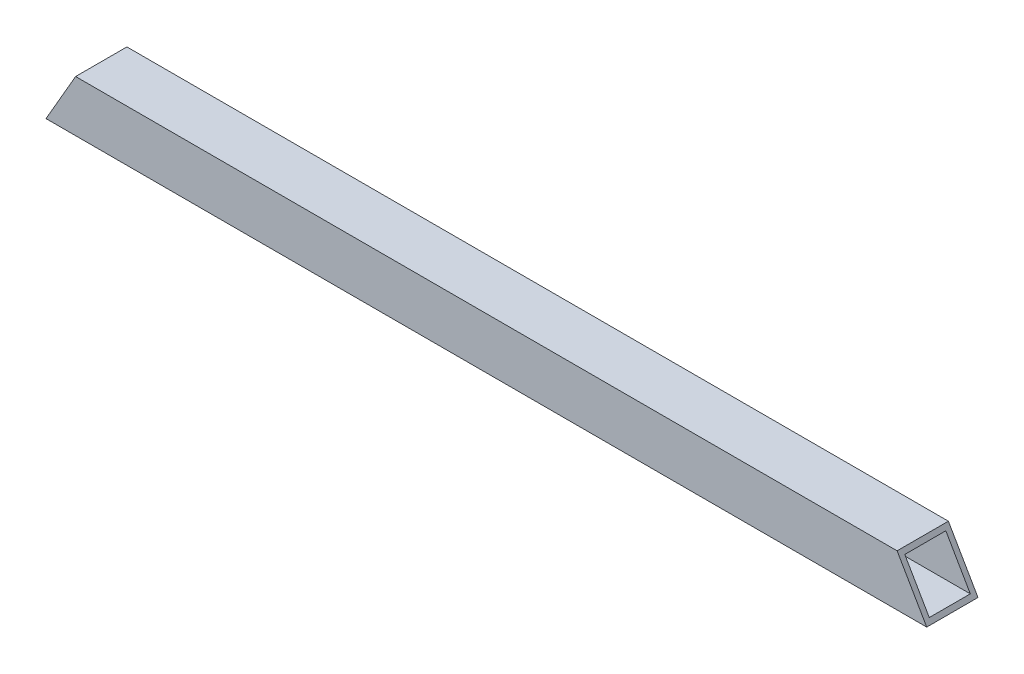
ISO-10303-21;
HEADER;
FILE_DESCRIPTION(('STEP AP214'),'2;1');
FILE_NAME('part.step','',(''),(''),'','','');
FILE_SCHEMA(('AUTOMOTIVE_DESIGN { 1 0 10303 214 1 1 1 1 }'));
ENDSEC;
DATA;
#1=APPLICATION_CONTEXT('core data for automotive mechanical design processes');
#2=APPLICATION_PROTOCOL_DEFINITION('international standard','automotive_design',2000,#1);
#3=PRODUCT_CONTEXT('',#1,'mechanical');
#4=PRODUCT('Part','Part','',(#3));
#5=PRODUCT_RELATED_PRODUCT_CATEGORY('part','',(#4));
#6=PRODUCT_DEFINITION_FORMATION('','',#4);
#7=PRODUCT_DEFINITION_CONTEXT('part definition',#1,'design');
#8=PRODUCT_DEFINITION('design','',#6,#7);
#9=PRODUCT_DEFINITION_SHAPE('','',#8);
#10=(LENGTH_UNIT() NAMED_UNIT(*) SI_UNIT(.MILLI.,.METRE.));
#11=(NAMED_UNIT(*) PLANE_ANGLE_UNIT() SI_UNIT($,.RADIAN.));
#12=(NAMED_UNIT(*) SI_UNIT($,.STERADIAN.) SOLID_ANGLE_UNIT());
#13=UNCERTAINTY_MEASURE_WITH_UNIT(LENGTH_MEASURE(1.E-05),#10,'distance_accuracy_value','');
#14=(GEOMETRIC_REPRESENTATION_CONTEXT(3) GLOBAL_UNCERTAINTY_ASSIGNED_CONTEXT((#13)) GLOBAL_UNIT_ASSIGNED_CONTEXT((#10,
#11,#12)) REPRESENTATION_CONTEXT('',''));
#15=CARTESIAN_POINT('',(0.,0.,0.));
#16=DIRECTION('',(0.,0.,1.));
#17=DIRECTION('',(1.,0.,0.));
#18=AXIS2_PLACEMENT_3D('',#15,#16,#17);
#19=CARTESIAN_POINT('',(-48.421052631579,24.6052631578947,20.));
#20=DIRECTION('',(0.865969252911153,-0.50009724355619,0.));
#21=DIRECTION('',(0.50009724355619,0.865969252911153,0.));
#22=AXIS2_PLACEMENT_3D('',#19,#20,#21);
#23=PLANE('',#22);
#24=DIRECTION('',(0.,0.,1.));
#25=VECTOR('',#24,1.);
#26=CARTESIAN_POINT('',(-49.4212471186913,22.8733246520724,20.));
#27=LINE('',#26,#25);
#28=CARTESIAN_POINT('',(-49.4212471186913,22.8733246520724,2.));
#29=VERTEX_POINT('',#28);
#30=CARTESIAN_POINT('',(-49.4212471186913,22.8733246520724,18.));
#31=VERTEX_POINT('',#30);
#32=EDGE_CURVE('E147',#29,#31,#27,.T.);
#33=ORIENTED_EDGE('',*,*,#32,.T.);
#34=DIRECTION('',(-0.50009724355619,-0.865969252911153,0.));
#35=VECTOR('',#34,1.);
#36=CARTESIAN_POINT('',(-48.421052631579,24.6052631578947,18.));
#37=LINE('',#36,#35);
#38=CARTESIAN_POINT('',(-58.9708581444666,6.33720166371705,18.));
#39=VERTEX_POINT('',#38);
#40=EDGE_CURVE('E137',#31,#39,#37,.T.);
#41=ORIENTED_EDGE('',*,*,#40,.T.);
#42=DIRECTION('',(0.,0.,-1.));
#43=VECTOR('',#42,1.);
#44=CARTESIAN_POINT('',(-58.9708581444666,6.33720166371705,20.));
#45=LINE('',#44,#43);
#46=CARTESIAN_POINT('',(-58.9708581444666,6.33720166371705,1.99999999999999));
#47=VERTEX_POINT('',#46);
#48=EDGE_CURVE('E151',#39,#47,#45,.T.);
#49=ORIENTED_EDGE('',*,*,#48,.T.);
#50=DIRECTION('',(0.50009724355619,0.865969252911153,0.));
#51=VECTOR('',#50,1.);
#52=CARTESIAN_POINT('',(-48.421052631579,24.6052631578947,2.));
#53=LINE('',#52,#51);
#54=EDGE_CURVE('E106',#47,#29,#53,.T.);
#55=ORIENTED_EDGE('',*,*,#54,.T.);
#56=EDGE_LOOP('',(#33,#41,#49,#55));
#57=FACE_BOUND('',#56,.T.);
#58=DIRECTION('',(-0.50009724355619,-0.865969252911153,0.));
#59=VECTOR('',#58,1.);
#60=CARTESIAN_POINT('',(-48.421052631579,24.6052631578947,0.));
#61=LINE('',#60,#59);
#62=CARTESIAN_POINT('',(-48.421052631579,24.6052631578947,0.));
#63=VERTEX_POINT('',#62);
#64=CARTESIAN_POINT('',(-59.9710526315789,4.60526315789474,0.));
#65=VERTEX_POINT('',#64);
#66=EDGE_CURVE('E134',#63,#65,#61,.T.);
#67=ORIENTED_EDGE('',*,*,#66,.T.);
#68=DIRECTION('',(0.,0.,-1.));
#69=VECTOR('',#68,1.);
#70=CARTESIAN_POINT('',(-59.9710526315789,4.60526315789474,20.));
#71=LINE('',#70,#69);
#72=CARTESIAN_POINT('',(-59.9710526315789,4.60526315789474,20.));
#73=VERTEX_POINT('',#72);
#74=EDGE_CURVE('E99',#73,#65,#71,.T.);
#75=ORIENTED_EDGE('',*,*,#74,.F.);
#76=DIRECTION('',(-0.50009724355619,-0.865969252911153,0.));
#77=VECTOR('',#76,1.);
#78=CARTESIAN_POINT('',(-48.421052631579,24.6052631578947,20.));
#79=LINE('',#78,#77);
#80=CARTESIAN_POINT('',(-48.421052631579,24.6052631578947,20.));
#81=VERTEX_POINT('',#80);
#82=EDGE_CURVE('E129',#81,#73,#79,.T.);
#83=ORIENTED_EDGE('',*,*,#82,.F.);
#84=DIRECTION('',(0.,0.,-1.));
#85=VECTOR('',#84,1.);
#86=CARTESIAN_POINT('',(-48.421052631579,24.6052631578947,20.));
#87=LINE('',#86,#85);
#88=EDGE_CURVE('E123',#81,#63,#87,.T.);
#89=ORIENTED_EDGE('',*,*,#88,.T.);
#90=EDGE_LOOP('',(#67,#75,#83,#89));
#91=FACE_BOUND('',#90,.T.);
#92=ADVANCED_FACE('F33',(#57,#91),#23,.F.);
#93=CARTESIAN_POINT('',(-59.9710526315789,4.60526315789474,20.));
#94=DIRECTION('',(0.,1.,0.));
#95=DIRECTION('',(0.,0.,1.));
#96=AXIS2_PLACEMENT_3D('',#93,#94,#95);
#97=PLANE('',#96);
#98=DIRECTION('',(1.,0.,0.));
#99=VECTOR('',#98,1.);
#100=CARTESIAN_POINT('',(-59.9710526315789,4.60526315789474,0.));
#101=LINE('',#100,#99);
#102=CARTESIAN_POINT('',(283.538947368421,4.60526315789474,0.));
#103=VERTEX_POINT('',#102);
#104=EDGE_CURVE('E132',#65,#103,#101,.T.);
#105=ORIENTED_EDGE('',*,*,#104,.T.);
#106=DIRECTION('',(0.,0.,-1.));
#107=VECTOR('',#106,1.);
#108=CARTESIAN_POINT('',(283.538947368421,4.60526315789474,20.));
#109=LINE('',#108,#107);
#110=CARTESIAN_POINT('',(283.538947368421,4.60526315789474,20.));
#111=VERTEX_POINT('',#110);
#112=EDGE_CURVE('E117',#111,#103,#109,.T.);
#113=ORIENTED_EDGE('',*,*,#112,.F.);
#114=DIRECTION('',(1.,0.,0.));
#115=VECTOR('',#114,1.);
#116=CARTESIAN_POINT('',(-59.9710526315789,4.60526315789474,20.));
#117=LINE('',#116,#115);
#118=EDGE_CURVE('E141',#73,#111,#117,.T.);
#119=ORIENTED_EDGE('',*,*,#118,.F.);
#120=ORIENTED_EDGE('',*,*,#74,.T.);
#121=EDGE_LOOP('',(#105,#113,#119,#120));
#122=FACE_BOUND('',#121,.T.);
#123=ADVANCED_FACE('F165',(#122),#97,.F.);
#124=CARTESIAN_POINT('',(271.988947368421,24.6052631578947,20.));
#125=DIRECTION('',(-0.865969252911153,-0.500097243556191,0.));
#126=DIRECTION('',(0.500097243556191,-0.865969252911153,0.));
#127=AXIS2_PLACEMENT_3D('',#124,#125,#126);
#128=PLANE('',#127);
#129=DIRECTION('',(0.,0.,1.));
#130=VECTOR('',#129,1.);
#131=CARTESIAN_POINT('',(282.538752881309,6.33720166371705,20.));
#132=LINE('',#131,#130);
#133=CARTESIAN_POINT('',(282.538752881309,6.33720166371705,1.99999999999999));
#134=VERTEX_POINT('',#133);
#135=CARTESIAN_POINT('',(282.538752881309,6.33720166371705,18.));
#136=VERTEX_POINT('',#135);
#137=EDGE_CURVE('E94',#134,#136,#132,.T.);
#138=ORIENTED_EDGE('',*,*,#137,.T.);
#139=DIRECTION('',(-0.500097243556191,0.865969252911153,0.));
#140=VECTOR('',#139,1.);
#141=CARTESIAN_POINT('',(271.988947368421,24.6052631578947,18.));
#142=LINE('',#141,#140);
#143=CARTESIAN_POINT('',(272.989141855533,22.8733246520724,18.));
#144=VERTEX_POINT('',#143);
#145=EDGE_CURVE('E11',#136,#144,#142,.T.);
#146=ORIENTED_EDGE('',*,*,#145,.T.);
#147=DIRECTION('',(0.,0.,-1.));
#148=VECTOR('',#147,1.);
#149=CARTESIAN_POINT('',(272.989141855533,22.8733246520724,20.));
#150=LINE('',#149,#148);
#151=CARTESIAN_POINT('',(272.989141855533,22.8733246520724,2.));
#152=VERTEX_POINT('',#151);
#153=EDGE_CURVE('E40',#144,#152,#150,.T.);
#154=ORIENTED_EDGE('',*,*,#153,.T.);
#155=DIRECTION('',(0.500097243556191,-0.865969252911153,0.));
#156=VECTOR('',#155,1.);
#157=CARTESIAN_POINT('',(271.988947368421,24.6052631578947,2.));
#158=LINE('',#157,#156);
#159=EDGE_CURVE('E98',#152,#134,#158,.T.);
#160=ORIENTED_EDGE('',*,*,#159,.T.);
#161=EDGE_LOOP('',(#138,#146,#154,#160));
#162=FACE_BOUND('',#161,.T.);
#163=DIRECTION('',(-0.500097243556191,0.865969252911153,0.));
#164=VECTOR('',#163,1.);
#165=CARTESIAN_POINT('',(271.988947368421,24.6052631578947,0.));
#166=LINE('',#165,#164);
#167=CARTESIAN_POINT('',(271.988947368421,24.6052631578947,0.));
#168=VERTEX_POINT('',#167);
#169=EDGE_CURVE('E130',#103,#168,#166,.T.);
#170=ORIENTED_EDGE('',*,*,#169,.T.);
#171=DIRECTION('',(0.,0.,-1.));
#172=VECTOR('',#171,1.);
#173=CARTESIAN_POINT('',(271.988947368421,24.6052631578947,20.));
#174=LINE('',#173,#172);
#175=CARTESIAN_POINT('',(271.988947368421,24.6052631578947,20.));
#176=VERTEX_POINT('',#175);
#177=EDGE_CURVE('E120',#176,#168,#174,.T.);
#178=ORIENTED_EDGE('',*,*,#177,.F.);
#179=DIRECTION('',(-0.500097243556191,0.865969252911153,0.));
#180=VECTOR('',#179,1.);
#181=CARTESIAN_POINT('',(271.988947368421,24.6052631578947,20.));
#182=LINE('',#181,#180);
#183=EDGE_CURVE('E139',#111,#176,#182,.T.);
#184=ORIENTED_EDGE('',*,*,#183,.F.);
#185=ORIENTED_EDGE('',*,*,#112,.T.);
#186=EDGE_LOOP('',(#170,#178,#184,#185));
#187=FACE_BOUND('',#186,.T.);
#188=ADVANCED_FACE('F111',(#162,#187),#128,.F.);
#189=CARTESIAN_POINT('',(-48.421052631579,24.6052631578947,20.));
#190=DIRECTION('',(0.,-1.,0.));
#191=DIRECTION('',(0.,0.,-1.));
#192=AXIS2_PLACEMENT_3D('',#189,#190,#191);
#193=PLANE('',#192);
#194=DIRECTION('',(-1.,0.,0.));
#195=VECTOR('',#194,1.);
#196=CARTESIAN_POINT('',(-48.421052631579,24.6052631578947,0.));
#197=LINE('',#196,#195);
#198=EDGE_CURVE('E127',#168,#63,#197,.T.);
#199=ORIENTED_EDGE('',*,*,#198,.T.);
#200=ORIENTED_EDGE('',*,*,#88,.F.);
#201=DIRECTION('',(-1.,0.,0.));
#202=VECTOR('',#201,1.);
#203=CARTESIAN_POINT('',(-48.421052631579,24.6052631578947,20.));
#204=LINE('',#203,#202);
#205=EDGE_CURVE('E126',#176,#81,#204,.T.);
#206=ORIENTED_EDGE('',*,*,#205,.F.);
#207=ORIENTED_EDGE('',*,*,#177,.T.);
#208=EDGE_LOOP('',(#199,#200,#206,#207));
#209=FACE_BOUND('',#208,.T.);
#210=ADVANCED_FACE('F182',(#209),#193,.F.);
#211=CARTESIAN_POINT('',(0.,0.,20.));
#212=DIRECTION('',(0.,0.,1.));
#213=DIRECTION('',(1.,0.,0.));
#214=AXIS2_PLACEMENT_3D('',#211,#212,#213);
#215=PLANE('',#214);
#216=ORIENTED_EDGE('',*,*,#82,.T.);
#217=ORIENTED_EDGE('',*,*,#118,.T.);
#218=ORIENTED_EDGE('',*,*,#183,.T.);
#219=ORIENTED_EDGE('',*,*,#205,.T.);
#220=EDGE_LOOP('',(#216,#217,#218,#219));
#221=FACE_BOUND('',#220,.T.);
#222=ADVANCED_FACE('F178',(#221),#215,.T.);
#223=CARTESIAN_POINT('',(0.,0.,0.));
#224=DIRECTION('',(0.,0.,1.));
#225=DIRECTION('',(1.,0.,0.));
#226=AXIS2_PLACEMENT_3D('',#223,#224,#225);
#227=PLANE('',#226);
#228=ORIENTED_EDGE('',*,*,#66,.F.);
#229=ORIENTED_EDGE('',*,*,#198,.F.);
#230=ORIENTED_EDGE('',*,*,#169,.F.);
#231=ORIENTED_EDGE('',*,*,#104,.F.);
#232=EDGE_LOOP('',(#228,#229,#230,#231));
#233=FACE_BOUND('',#232,.T.);
#234=ADVANCED_FACE('F172',(#233),#227,.F.);
#235=CARTESIAN_POINT('',(-59.9710526315789,22.8733246520724,18.));
#236=DIRECTION('',(0.,0.,1.));
#237=DIRECTION('',(0.,-1.,0.));
#238=AXIS2_PLACEMENT_3D('',#235,#236,#237);
#239=PLANE('',#238);
#240=DIRECTION('',(1.,0.,0.));
#241=VECTOR('',#240,1.);
#242=CARTESIAN_POINT('',(-59.9710526315789,22.8733246520724,18.));
#243=LINE('',#242,#241);
#244=EDGE_CURVE('E153',#31,#144,#243,.T.);
#245=ORIENTED_EDGE('',*,*,#244,.T.);
#246=ORIENTED_EDGE('',*,*,#145,.F.);
#247=DIRECTION('',(1.,0.,0.));
#248=VECTOR('',#247,1.);
#249=CARTESIAN_POINT('',(-59.9710526315789,6.33720166371705,18.));
#250=LINE('',#249,#248);
#251=EDGE_CURVE('E52',#39,#136,#250,.T.);
#252=ORIENTED_EDGE('',*,*,#251,.F.);
#253=ORIENTED_EDGE('',*,*,#40,.F.);
#254=EDGE_LOOP('',(#245,#246,#252,#253));
#255=FACE_BOUND('',#254,.T.);
#256=ADVANCED_FACE('F159',(#255),#239,.F.);
#257=CARTESIAN_POINT('',(-59.9710526315789,22.8733246520724,2.));
#258=DIRECTION('',(0.,1.,0.));
#259=DIRECTION('',(0.,0.,1.));
#260=AXIS2_PLACEMENT_3D('',#257,#258,#259);
#261=PLANE('',#260);
#262=DIRECTION('',(1.,0.,0.));
#263=VECTOR('',#262,1.);
#264=CARTESIAN_POINT('',(-59.9710526315789,22.8733246520724,2.));
#265=LINE('',#264,#263);
#266=EDGE_CURVE('E108',#29,#152,#265,.T.);
#267=ORIENTED_EDGE('',*,*,#266,.T.);
#268=ORIENTED_EDGE('',*,*,#153,.F.);
#269=ORIENTED_EDGE('',*,*,#244,.F.);
#270=ORIENTED_EDGE('',*,*,#32,.F.);
#271=EDGE_LOOP('',(#267,#268,#269,#270));
#272=FACE_BOUND('',#271,.T.);
#273=ADVANCED_FACE('F161',(#272),#261,.F.);
#274=CARTESIAN_POINT('',(-59.9710526315789,6.33720166371705,1.99999999999999));
#275=DIRECTION('',(0.,0.,-1.));
#276=DIRECTION('',(0.,1.,0.));
#277=AXIS2_PLACEMENT_3D('',#274,#275,#276);
#278=PLANE('',#277);
#279=DIRECTION('',(1.,0.,0.));
#280=VECTOR('',#279,1.);
#281=CARTESIAN_POINT('',(-59.9710526315789,6.33720166371705,1.99999999999999));
#282=LINE('',#281,#280);
#283=EDGE_CURVE('E47',#47,#134,#282,.T.);
#284=ORIENTED_EDGE('',*,*,#283,.T.);
#285=ORIENTED_EDGE('',*,*,#159,.F.);
#286=ORIENTED_EDGE('',*,*,#266,.F.);
#287=ORIENTED_EDGE('',*,*,#54,.F.);
#288=EDGE_LOOP('',(#284,#285,#286,#287));
#289=FACE_BOUND('',#288,.T.);
#290=ADVANCED_FACE('F102',(#289),#278,.F.);
#291=CARTESIAN_POINT('',(-59.9710526315789,6.33720166371705,18.));
#292=DIRECTION('',(0.,-1.,0.));
#293=DIRECTION('',(0.,0.,-1.));
#294=AXIS2_PLACEMENT_3D('',#291,#292,#293);
#295=PLANE('',#294);
#296=ORIENTED_EDGE('',*,*,#251,.T.);
#297=ORIENTED_EDGE('',*,*,#137,.F.);
#298=ORIENTED_EDGE('',*,*,#283,.F.);
#299=ORIENTED_EDGE('',*,*,#48,.F.);
#300=EDGE_LOOP('',(#296,#297,#298,#299));
#301=FACE_BOUND('',#300,.T.);
#302=ADVANCED_FACE('F95',(#301),#295,.F.);
#303=CLOSED_SHELL('',(#92,#123,#188,#210,#222,#234,#256,#273,#290,#302));
#304=MANIFOLD_SOLID_BREP('B2',#303);
#305=ADVANCED_BREP_SHAPE_REPRESENTATION('',(#18,#304),#14);
#306=SHAPE_DEFINITION_REPRESENTATION(#9,#305);
ENDSEC;
END-ISO-10303-21;
